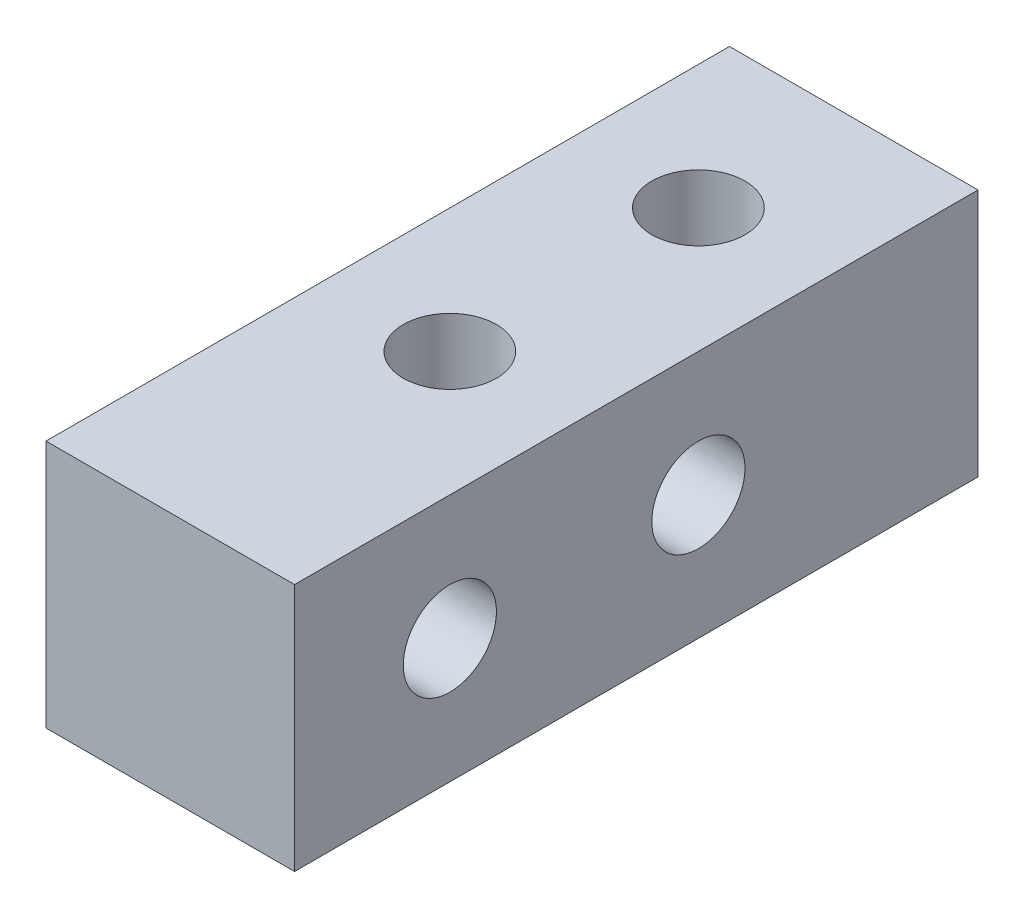
ISO-10303-21;
HEADER;
FILE_DESCRIPTION(('STEP AP214'),'2;1');
FILE_NAME('part.step','',(''),(''),'','','');
FILE_SCHEMA(('AUTOMOTIVE_DESIGN { 1 0 10303 214 1 1 1 1 }'));
ENDSEC;
DATA;
#1=APPLICATION_CONTEXT('core data for automotive mechanical design processes');
#2=APPLICATION_PROTOCOL_DEFINITION('international standard','automotive_design',2000,#1);
#3=PRODUCT_CONTEXT('',#1,'mechanical');
#4=PRODUCT('Part','Part','',(#3));
#5=PRODUCT_RELATED_PRODUCT_CATEGORY('part','',(#4));
#6=PRODUCT_DEFINITION_FORMATION('','',#4);
#7=PRODUCT_DEFINITION_CONTEXT('part definition',#1,'design');
#8=PRODUCT_DEFINITION('design','',#6,#7);
#9=PRODUCT_DEFINITION_SHAPE('','',#8);
#10=(LENGTH_UNIT() NAMED_UNIT(*) SI_UNIT(.MILLI.,.METRE.));
#11=(NAMED_UNIT(*) PLANE_ANGLE_UNIT() SI_UNIT($,.RADIAN.));
#12=(NAMED_UNIT(*) SI_UNIT($,.STERADIAN.) SOLID_ANGLE_UNIT());
#13=UNCERTAINTY_MEASURE_WITH_UNIT(LENGTH_MEASURE(1.E-05),#10,'distance_accuracy_value','');
#14=(GEOMETRIC_REPRESENTATION_CONTEXT(3) GLOBAL_UNCERTAINTY_ASSIGNED_CONTEXT((#13)) GLOBAL_UNIT_ASSIGNED_CONTEXT((#10,
#11,#12)) REPRESENTATION_CONTEXT('',''));
#15=CARTESIAN_POINT('',(0.,0.,0.));
#16=DIRECTION('',(0.,0.,1.));
#17=DIRECTION('',(1.,0.,0.));
#18=AXIS2_PLACEMENT_3D('',#15,#16,#17);
#19=CARTESIAN_POINT('',(-4.,-4.,22.));
#20=DIRECTION('',(1.,0.,0.));
#21=DIRECTION('',(0.,0.,-1.));
#22=AXIS2_PLACEMENT_3D('',#19,#20,#21);
#23=PLANE('',#22);
#24=CARTESIAN_POINT('',(-4.,0.,17.));
#25=DIRECTION('',(1.,0.,0.));
#26=DIRECTION('',(0.,0.,-1.));
#27=AXIS2_PLACEMENT_3D('',#24,#25,#26);
#28=CIRCLE('',#27,1.5);
#29=CARTESIAN_POINT('',(-4.,0.,15.5));
#30=VERTEX_POINT('',#29);
#31=EDGE_CURVE('E103',#30,#30,#28,.T.);
#32=ORIENTED_EDGE('',*,*,#31,.T.);
#33=EDGE_LOOP('',(#32));
#34=FACE_BOUND('',#33,.T.);
#35=CARTESIAN_POINT('',(-4.,0.,9.));
#36=DIRECTION('',(1.,0.,0.));
#37=DIRECTION('',(0.,0.,-1.));
#38=AXIS2_PLACEMENT_3D('',#35,#36,#37);
#39=CIRCLE('',#38,1.5);
#40=CARTESIAN_POINT('',(-4.,0.,7.5));
#41=VERTEX_POINT('',#40);
#42=EDGE_CURVE('E117',#41,#41,#39,.T.);
#43=ORIENTED_EDGE('',*,*,#42,.T.);
#44=EDGE_LOOP('',(#43));
#45=FACE_BOUND('',#44,.T.);
#46=DIRECTION('',(0.,-1.,0.));
#47=VECTOR('',#46,1.);
#48=CARTESIAN_POINT('',(-4.,-4.,0.));
#49=LINE('',#48,#47);
#50=CARTESIAN_POINT('',(-4.,4.,0.));
#51=VERTEX_POINT('',#50);
#52=CARTESIAN_POINT('',(-4.,-4.,0.));
#53=VERTEX_POINT('',#52);
#54=EDGE_CURVE('E100',#51,#53,#49,.T.);
#55=ORIENTED_EDGE('',*,*,#54,.T.);
#56=DIRECTION('',(0.,0.,-1.));
#57=VECTOR('',#56,1.);
#58=CARTESIAN_POINT('',(-4.,-4.,22.));
#59=LINE('',#58,#57);
#60=CARTESIAN_POINT('',(-4.,-4.,22.));
#61=VERTEX_POINT('',#60);
#62=EDGE_CURVE('E11',#61,#53,#59,.T.);
#63=ORIENTED_EDGE('',*,*,#62,.F.);
#64=DIRECTION('',(0.,-1.,0.));
#65=VECTOR('',#64,1.);
#66=CARTESIAN_POINT('',(-4.,-4.,22.));
#67=LINE('',#66,#65);
#68=CARTESIAN_POINT('',(-4.,4.,22.));
#69=VERTEX_POINT('',#68);
#70=EDGE_CURVE('E88',#69,#61,#67,.T.);
#71=ORIENTED_EDGE('',*,*,#70,.F.);
#72=DIRECTION('',(0.,0.,-1.));
#73=VECTOR('',#72,1.);
#74=CARTESIAN_POINT('',(-4.,4.,22.));
#75=LINE('',#74,#73);
#76=EDGE_CURVE('E96',#69,#51,#75,.T.);
#77=ORIENTED_EDGE('',*,*,#76,.T.);
#78=EDGE_LOOP('',(#55,#63,#71,#77));
#79=FACE_BOUND('',#78,.T.);
#80=ADVANCED_FACE('F37',(#34,#45,#79),#23,.F.);
#81=CARTESIAN_POINT('',(4.,-4.,22.));
#82=DIRECTION('',(0.,1.,0.));
#83=DIRECTION('',(0.,0.,1.));
#84=AXIS2_PLACEMENT_3D('',#81,#82,#83);
#85=PLANE('',#84);
#86=CARTESIAN_POINT('',(0.,-4.,5.));
#87=DIRECTION('',(0.,1.,0.));
#88=DIRECTION('',(0.,0.,1.));
#89=AXIS2_PLACEMENT_3D('',#86,#87,#88);
#90=CIRCLE('',#89,1.5);
#91=CARTESIAN_POINT('',(0.,-4.,6.5));
#92=VERTEX_POINT('',#91);
#93=EDGE_CURVE('E118',#92,#92,#90,.T.);
#94=ORIENTED_EDGE('',*,*,#93,.T.);
#95=EDGE_LOOP('',(#94));
#96=FACE_BOUND('',#95,.T.);
#97=CARTESIAN_POINT('',(0.,-4.,13.));
#98=DIRECTION('',(0.,1.,0.));
#99=DIRECTION('',(0.,0.,1.));
#100=AXIS2_PLACEMENT_3D('',#97,#98,#99);
#101=CIRCLE('',#100,1.5);
#102=CARTESIAN_POINT('',(0.,-4.,14.5));
#103=VERTEX_POINT('',#102);
#104=EDGE_CURVE('E128',#103,#103,#101,.T.);
#105=ORIENTED_EDGE('',*,*,#104,.T.);
#106=EDGE_LOOP('',(#105));
#107=FACE_BOUND('',#106,.T.);
#108=DIRECTION('',(1.,0.,0.));
#109=VECTOR('',#108,1.);
#110=CARTESIAN_POINT('',(4.,-4.,0.));
#111=LINE('',#110,#109);
#112=CARTESIAN_POINT('',(4.,-4.,0.));
#113=VERTEX_POINT('',#112);
#114=EDGE_CURVE('E92',#53,#113,#111,.T.);
#115=ORIENTED_EDGE('',*,*,#114,.T.);
#116=DIRECTION('',(0.,0.,-1.));
#117=VECTOR('',#116,1.);
#118=CARTESIAN_POINT('',(4.,-4.,22.));
#119=LINE('',#118,#117);
#120=CARTESIAN_POINT('',(4.,-4.,22.));
#121=VERTEX_POINT('',#120);
#122=EDGE_CURVE('E45',#121,#113,#119,.T.);
#123=ORIENTED_EDGE('',*,*,#122,.F.);
#124=DIRECTION('',(1.,0.,0.));
#125=VECTOR('',#124,1.);
#126=CARTESIAN_POINT('',(4.,-4.,22.));
#127=LINE('',#126,#125);
#128=EDGE_CURVE('E83',#61,#121,#127,.T.);
#129=ORIENTED_EDGE('',*,*,#128,.F.);
#130=ORIENTED_EDGE('',*,*,#62,.T.);
#131=EDGE_LOOP('',(#115,#123,#129,#130));
#132=FACE_BOUND('',#131,.T.);
#133=ADVANCED_FACE('F91',(#96,#107,#132),#85,.F.);
#134=CARTESIAN_POINT('',(4.,-4.,22.));
#135=DIRECTION('',(-1.,0.,0.));
#136=DIRECTION('',(0.,0.,1.));
#137=AXIS2_PLACEMENT_3D('',#134,#135,#136);
#138=PLANE('',#137);
#139=CARTESIAN_POINT('',(4.,0.,17.));
#140=DIRECTION('',(1.,0.,0.));
#141=DIRECTION('',(0.,0.,-1.));
#142=AXIS2_PLACEMENT_3D('',#139,#140,#141);
#143=CIRCLE('',#142,1.5);
#144=CARTESIAN_POINT('',(4.,0.,15.5));
#145=VERTEX_POINT('',#144);
#146=EDGE_CURVE('E121',#145,#145,#143,.T.);
#147=ORIENTED_EDGE('',*,*,#146,.F.);
#148=EDGE_LOOP('',(#147));
#149=FACE_BOUND('',#148,.T.);
#150=CARTESIAN_POINT('',(4.,0.,9.));
#151=DIRECTION('',(1.,0.,0.));
#152=DIRECTION('',(0.,0.,-1.));
#153=AXIS2_PLACEMENT_3D('',#150,#151,#152);
#154=CIRCLE('',#153,1.5);
#155=CARTESIAN_POINT('',(4.,0.,7.5));
#156=VERTEX_POINT('',#155);
#157=EDGE_CURVE('E114',#156,#156,#154,.T.);
#158=ORIENTED_EDGE('',*,*,#157,.F.);
#159=EDGE_LOOP('',(#158));
#160=FACE_BOUND('',#159,.T.);
#161=DIRECTION('',(0.,1.,0.));
#162=VECTOR('',#161,1.);
#163=CARTESIAN_POINT('',(4.,-4.,0.));
#164=LINE('',#163,#162);
#165=CARTESIAN_POINT('',(4.,4.,0.));
#166=VERTEX_POINT('',#165);
#167=EDGE_CURVE('E70',#113,#166,#164,.T.);
#168=ORIENTED_EDGE('',*,*,#167,.T.);
#169=DIRECTION('',(0.,0.,-1.));
#170=VECTOR('',#169,1.);
#171=CARTESIAN_POINT('',(4.,4.,22.));
#172=LINE('',#171,#170);
#173=CARTESIAN_POINT('',(4.,4.,22.));
#174=VERTEX_POINT('',#173);
#175=EDGE_CURVE('E93',#174,#166,#172,.T.);
#176=ORIENTED_EDGE('',*,*,#175,.F.);
#177=DIRECTION('',(0.,1.,0.));
#178=VECTOR('',#177,1.);
#179=CARTESIAN_POINT('',(4.,-4.,22.));
#180=LINE('',#179,#178);
#181=EDGE_CURVE('E86',#121,#174,#180,.T.);
#182=ORIENTED_EDGE('',*,*,#181,.F.);
#183=ORIENTED_EDGE('',*,*,#122,.T.);
#184=EDGE_LOOP('',(#168,#176,#182,#183));
#185=FACE_BOUND('',#184,.T.);
#186=ADVANCED_FACE('F94',(#149,#160,#185),#138,.F.);
#187=CARTESIAN_POINT('',(4.,4.,22.));
#188=DIRECTION('',(0.,-1.,0.));
#189=DIRECTION('',(0.,0.,-1.));
#190=AXIS2_PLACEMENT_3D('',#187,#188,#189);
#191=PLANE('',#190);
#192=CARTESIAN_POINT('',(0.,4.,5.));
#193=DIRECTION('',(0.,1.,0.));
#194=DIRECTION('',(0.,0.,1.));
#195=AXIS2_PLACEMENT_3D('',#192,#193,#194);
#196=CIRCLE('',#195,1.5);
#197=CARTESIAN_POINT('',(0.,4.,6.5));
#198=VERTEX_POINT('',#197);
#199=EDGE_CURVE('E131',#198,#198,#196,.T.);
#200=ORIENTED_EDGE('',*,*,#199,.F.);
#201=EDGE_LOOP('',(#200));
#202=FACE_BOUND('',#201,.T.);
#203=CARTESIAN_POINT('',(0.,4.,13.));
#204=DIRECTION('',(0.,1.,0.));
#205=DIRECTION('',(0.,0.,1.));
#206=AXIS2_PLACEMENT_3D('',#203,#204,#205);
#207=CIRCLE('',#206,1.5);
#208=CARTESIAN_POINT('',(0.,4.,14.5));
#209=VERTEX_POINT('',#208);
#210=EDGE_CURVE('E132',#209,#209,#207,.T.);
#211=ORIENTED_EDGE('',*,*,#210,.F.);
#212=EDGE_LOOP('',(#211));
#213=FACE_BOUND('',#212,.T.);
#214=DIRECTION('',(-1.,0.,0.));
#215=VECTOR('',#214,1.);
#216=CARTESIAN_POINT('',(4.,4.,0.));
#217=LINE('',#216,#215);
#218=EDGE_CURVE('E76',#166,#51,#217,.T.);
#219=ORIENTED_EDGE('',*,*,#218,.T.);
#220=ORIENTED_EDGE('',*,*,#76,.F.);
#221=DIRECTION('',(-1.,0.,0.));
#222=VECTOR('',#221,1.);
#223=CARTESIAN_POINT('',(4.,4.,22.));
#224=LINE('',#223,#222);
#225=EDGE_CURVE('E53',#174,#69,#224,.T.);
#226=ORIENTED_EDGE('',*,*,#225,.F.);
#227=ORIENTED_EDGE('',*,*,#175,.T.);
#228=EDGE_LOOP('',(#219,#220,#226,#227));
#229=FACE_BOUND('',#228,.T.);
#230=ADVANCED_FACE('F108',(#202,#213,#229),#191,.F.);
#231=CARTESIAN_POINT('',(0.,0.,22.));
#232=DIRECTION('',(0.,0.,1.));
#233=DIRECTION('',(1.,0.,0.));
#234=AXIS2_PLACEMENT_3D('',#231,#232,#233);
#235=PLANE('',#234);
#236=ORIENTED_EDGE('',*,*,#70,.T.);
#237=ORIENTED_EDGE('',*,*,#128,.T.);
#238=ORIENTED_EDGE('',*,*,#181,.T.);
#239=ORIENTED_EDGE('',*,*,#225,.T.);
#240=EDGE_LOOP('',(#236,#237,#238,#239));
#241=FACE_BOUND('',#240,.T.);
#242=ADVANCED_FACE('F84',(#241),#235,.T.);
#243=CARTESIAN_POINT('',(0.,0.,0.));
#244=DIRECTION('',(0.,0.,1.));
#245=DIRECTION('',(1.,0.,0.));
#246=AXIS2_PLACEMENT_3D('',#243,#244,#245);
#247=PLANE('',#246);
#248=ORIENTED_EDGE('',*,*,#54,.F.);
#249=ORIENTED_EDGE('',*,*,#218,.F.);
#250=ORIENTED_EDGE('',*,*,#167,.F.);
#251=ORIENTED_EDGE('',*,*,#114,.F.);
#252=EDGE_LOOP('',(#248,#249,#250,#251));
#253=FACE_BOUND('',#252,.T.);
#254=ADVANCED_FACE('F111',(#253),#247,.F.);
#255=CARTESIAN_POINT('',(-4.,0.,9.));
#256=DIRECTION('',(1.,0.,0.));
#257=DIRECTION('',(0.,0.,-1.));
#258=AXIS2_PLACEMENT_3D('',#255,#256,#257);
#259=CYLINDRICAL_SURFACE('',#258,1.5);
#260=ORIENTED_EDGE('',*,*,#42,.F.);
#261=EDGE_LOOP('',(#260));
#262=FACE_BOUND('',#261,.T.);
#263=ORIENTED_EDGE('',*,*,#157,.T.);
#264=EDGE_LOOP('',(#263));
#265=FACE_BOUND('',#264,.T.);
#266=ADVANCED_FACE('F166',(#262,#265),#259,.F.);
#267=CARTESIAN_POINT('',(-4.,0.,17.));
#268=DIRECTION('',(1.,0.,0.));
#269=DIRECTION('',(0.,0.,-1.));
#270=AXIS2_PLACEMENT_3D('',#267,#268,#269);
#271=CYLINDRICAL_SURFACE('',#270,1.5);
#272=ORIENTED_EDGE('',*,*,#31,.F.);
#273=EDGE_LOOP('',(#272));
#274=FACE_BOUND('',#273,.T.);
#275=ORIENTED_EDGE('',*,*,#146,.T.);
#276=EDGE_LOOP('',(#275));
#277=FACE_BOUND('',#276,.T.);
#278=ADVANCED_FACE('F149',(#274,#277),#271,.F.);
#279=CARTESIAN_POINT('',(0.,-18.,13.));
#280=DIRECTION('',(0.,1.,0.));
#281=DIRECTION('',(0.,0.,1.));
#282=AXIS2_PLACEMENT_3D('',#279,#280,#281);
#283=CYLINDRICAL_SURFACE('',#282,1.5);
#284=ORIENTED_EDGE('',*,*,#210,.T.);
#285=EDGE_LOOP('',(#284));
#286=FACE_BOUND('',#285,.T.);
#287=ORIENTED_EDGE('',*,*,#104,.F.);
#288=EDGE_LOOP('',(#287));
#289=FACE_BOUND('',#288,.T.);
#290=ADVANCED_FACE('F146',(#286,#289),#283,.F.);
#291=CARTESIAN_POINT('',(0.,-18.,5.));
#292=DIRECTION('',(0.,1.,0.));
#293=DIRECTION('',(0.,0.,1.));
#294=AXIS2_PLACEMENT_3D('',#291,#292,#293);
#295=CYLINDRICAL_SURFACE('',#294,1.5);
#296=ORIENTED_EDGE('',*,*,#199,.T.);
#297=EDGE_LOOP('',(#296));
#298=FACE_BOUND('',#297,.T.);
#299=ORIENTED_EDGE('',*,*,#93,.F.);
#300=EDGE_LOOP('',(#299));
#301=FACE_BOUND('',#300,.T.);
#302=ADVANCED_FACE('F138',(#298,#301),#295,.F.);
#303=CLOSED_SHELL('',(#80,#133,#186,#230,#242,#254,#266,#278,#290,#302));
#304=MANIFOLD_SOLID_BREP('B2',#303);
#305=ADVANCED_BREP_SHAPE_REPRESENTATION('',(#18,#304),#14);
#306=SHAPE_DEFINITION_REPRESENTATION(#9,#305);
ENDSEC;
END-ISO-10303-21;
